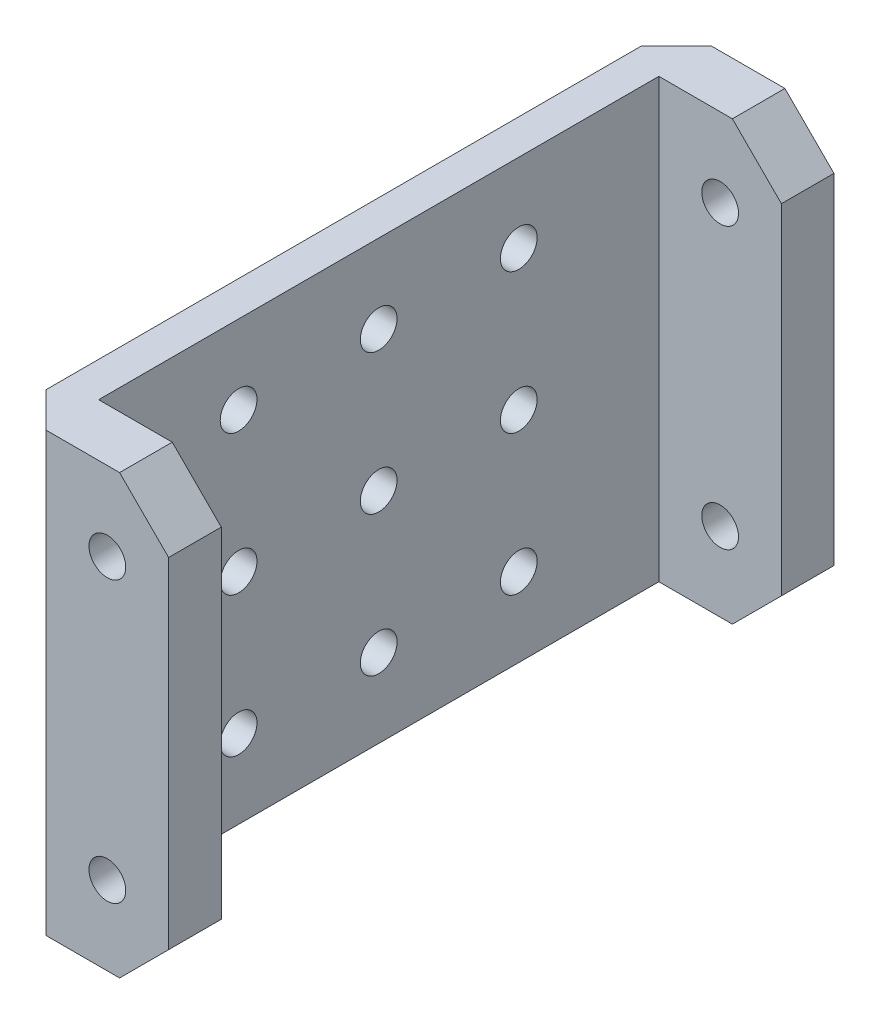
ISO-10303-21;
HEADER;
FILE_DESCRIPTION(('STEP AP214'),'2;1');
FILE_NAME('part.step','',(''),(''),'','','');
FILE_SCHEMA(('AUTOMOTIVE_DESIGN { 1 0 10303 214 1 1 1 1 }'));
ENDSEC;
DATA;
#1=APPLICATION_CONTEXT('core data for automotive mechanical design processes');
#2=APPLICATION_PROTOCOL_DEFINITION('international standard','automotive_design',2000,#1);
#3=PRODUCT_CONTEXT('',#1,'mechanical');
#4=PRODUCT('Part','Part','',(#3));
#5=PRODUCT_RELATED_PRODUCT_CATEGORY('part','',(#4));
#6=PRODUCT_DEFINITION_FORMATION('','',#4);
#7=PRODUCT_DEFINITION_CONTEXT('part definition',#1,'design');
#8=PRODUCT_DEFINITION('design','',#6,#7);
#9=PRODUCT_DEFINITION_SHAPE('','',#8);
#10=(LENGTH_UNIT() NAMED_UNIT(*) SI_UNIT(.MILLI.,.METRE.));
#11=(NAMED_UNIT(*) PLANE_ANGLE_UNIT() SI_UNIT($,.RADIAN.));
#12=(NAMED_UNIT(*) SI_UNIT($,.STERADIAN.) SOLID_ANGLE_UNIT());
#13=UNCERTAINTY_MEASURE_WITH_UNIT(LENGTH_MEASURE(1.E-05),#10,'distance_accuracy_value','');
#14=(GEOMETRIC_REPRESENTATION_CONTEXT(3) GLOBAL_UNCERTAINTY_ASSIGNED_CONTEXT((#13)) GLOBAL_UNIT_ASSIGNED_CONTEXT((#10,
#11,#12)) REPRESENTATION_CONTEXT('',''));
#15=CARTESIAN_POINT('',(0.,0.,0.));
#16=DIRECTION('',(0.,0.,1.));
#17=DIRECTION('',(1.,0.,0.));
#18=AXIS2_PLACEMENT_3D('',#15,#16,#17);
#19=CARTESIAN_POINT('',(9.,0.,0.));
#20=DIRECTION('',(-1.,0.,0.));
#21=DIRECTION('',(0.,0.,1.));
#22=AXIS2_PLACEMENT_3D('',#19,#20,#21);
#23=PLANE('',#22);
#24=DIRECTION('',(0.,1.,0.));
#25=VECTOR('',#24,1.);
#26=CARTESIAN_POINT('',(9.,0.,34.9928066134453));
#27=LINE('',#26,#25);
#28=CARTESIAN_POINT('',(9.,2.8,34.9928066134453));
#29=VERTEX_POINT('',#28);
#30=CARTESIAN_POINT('',(9.,22.2,34.9928066134453));
#31=VERTEX_POINT('',#30);
#32=EDGE_CURVE('E229',#29,#31,#27,.T.);
#33=ORIENTED_EDGE('',*,*,#32,.T.);
#34=DIRECTION('',(0.,0.,1.));
#35=VECTOR('',#34,1.);
#36=CARTESIAN_POINT('',(9.,22.2,0.));
#37=LINE('',#36,#35);
#38=CARTESIAN_POINT('',(9.,22.2,38.));
#39=VERTEX_POINT('',#38);
#40=EDGE_CURVE('E62',#31,#39,#37,.T.);
#41=ORIENTED_EDGE('',*,*,#40,.T.);
#42=DIRECTION('',(0.,1.,0.));
#43=VECTOR('',#42,1.);
#44=CARTESIAN_POINT('',(9.,0.,38.));
#45=LINE('',#44,#43);
#46=CARTESIAN_POINT('',(9.,2.8,38.));
#47=VERTEX_POINT('',#46);
#48=EDGE_CURVE('E241',#47,#39,#45,.T.);
#49=ORIENTED_EDGE('',*,*,#48,.F.);
#50=DIRECTION('',(0.,0.,1.));
#51=VECTOR('',#50,1.);
#52=CARTESIAN_POINT('',(9.,2.8,0.));
#53=LINE('',#52,#51);
#54=EDGE_CURVE('E278',#29,#47,#53,.T.);
#55=ORIENTED_EDGE('',*,*,#54,.F.);
#56=EDGE_LOOP('',(#33,#41,#49,#55));
#57=FACE_BOUND('',#56,.T.);
#58=ADVANCED_FACE('F38',(#57),#23,.F.);
#59=CARTESIAN_POINT('',(9.,0.,38.));
#60=DIRECTION('',(0.,0.,1.));
#61=DIRECTION('',(1.,0.,0.));
#62=AXIS2_PLACEMENT_3D('',#59,#60,#61);
#63=PLANE('',#62);
#64=DIRECTION('',(0.707106781186548,-0.707106781186548,0.));
#65=VECTOR('',#64,1.);
#66=CARTESIAN_POINT('',(20.1,11.1,38.));
#67=LINE('',#66,#65);
#68=CARTESIAN_POINT('',(6.2,25.,38.));
#69=VERTEX_POINT('',#68);
#70=EDGE_CURVE('E296',#69,#39,#67,.T.);
#71=ORIENTED_EDGE('',*,*,#70,.F.);
#72=DIRECTION('',(-1.,0.,0.));
#73=VECTOR('',#72,1.);
#74=CARTESIAN_POINT('',(9.,25.,38.));
#75=LINE('',#74,#73);
#76=CARTESIAN_POINT('',(1.99999999999999,25.,38.));
#77=VERTEX_POINT('',#76);
#78=EDGE_CURVE('E169',#69,#77,#75,.T.);
#79=ORIENTED_EDGE('',*,*,#78,.T.);
#80=DIRECTION('',(0.,-1.,0.));
#81=VECTOR('',#80,1.);
#82=CARTESIAN_POINT('',(1.99999999999999,0.,38.));
#83=LINE('',#82,#81);
#84=CARTESIAN_POINT('',(1.99999999999999,0.,38.));
#85=VERTEX_POINT('',#84);
#86=EDGE_CURVE('E203',#77,#85,#83,.T.);
#87=ORIENTED_EDGE('',*,*,#86,.T.);
#88=DIRECTION('',(-1.,0.,0.));
#89=VECTOR('',#88,1.);
#90=CARTESIAN_POINT('',(9.,0.,38.));
#91=LINE('',#90,#89);
#92=CARTESIAN_POINT('',(6.2,0.,38.));
#93=VERTEX_POINT('',#92);
#94=EDGE_CURVE('E173',#93,#85,#91,.T.);
#95=ORIENTED_EDGE('',*,*,#94,.F.);
#96=DIRECTION('',(-0.707106781186548,-0.707106781186548,0.));
#97=VECTOR('',#96,1.);
#98=CARTESIAN_POINT('',(7.6,1.4,38.));
#99=LINE('',#98,#97);
#100=EDGE_CURVE('E290',#47,#93,#99,.T.);
#101=ORIENTED_EDGE('',*,*,#100,.F.);
#102=ORIENTED_EDGE('',*,*,#48,.T.);
#103=EDGE_LOOP('',(#71,#79,#87,#95,#101,#102));
#104=FACE_BOUND('',#103,.T.);
#105=CARTESIAN_POINT('',(5.5,4.5,38.));
#106=DIRECTION('',(0.,0.,-1.));
#107=DIRECTION('',(-1.,0.,0.));
#108=AXIS2_PLACEMENT_3D('',#105,#106,#107);
#109=CIRCLE('',#108,1.04999999999999);
#110=CARTESIAN_POINT('',(4.45000000000001,4.5,38.));
#111=VERTEX_POINT('',#110);
#112=EDGE_CURVE('E363',#111,#111,#109,.T.);
#113=ORIENTED_EDGE('',*,*,#112,.T.);
#114=EDGE_LOOP('',(#113));
#115=FACE_BOUND('',#114,.T.);
#116=CARTESIAN_POINT('',(5.5,20.5,38.));
#117=DIRECTION('',(0.,0.,-1.));
#118=DIRECTION('',(-1.,0.,0.));
#119=AXIS2_PLACEMENT_3D('',#116,#117,#118);
#120=CIRCLE('',#119,1.04999999999999);
#121=CARTESIAN_POINT('',(4.45000000000001,20.5,38.));
#122=VERTEX_POINT('',#121);
#123=EDGE_CURVE('E371',#122,#122,#120,.T.);
#124=ORIENTED_EDGE('',*,*,#123,.T.);
#125=EDGE_LOOP('',(#124));
#126=FACE_BOUND('',#125,.T.);
#127=ADVANCED_FACE('F263',(#104,#115,#126),#63,.T.);
#128=CARTESIAN_POINT('',(9.,0.,0.));
#129=DIRECTION('',(0.,-1.,0.));
#130=DIRECTION('',(0.,0.,-1.));
#131=AXIS2_PLACEMENT_3D('',#128,#129,#130);
#132=PLANE('',#131);
#133=DIRECTION('',(0.,0.,1.));
#134=VECTOR('',#133,1.);
#135=CARTESIAN_POINT('',(6.2,0.,0.));
#136=LINE('',#135,#134);
#137=CARTESIAN_POINT('',(6.2,0.,34.9928066134453));
#138=VERTEX_POINT('',#137);
#139=EDGE_CURVE('E54',#138,#93,#136,.T.);
#140=ORIENTED_EDGE('',*,*,#139,.T.);
#141=ORIENTED_EDGE('',*,*,#94,.T.);
#142=DIRECTION('',(0.70710678118655,0.,0.707106781186545));
#143=VECTOR('',#142,1.);
#144=CARTESIAN_POINT('',(-13.5,0.,22.5000000000001));
#145=LINE('',#144,#143);
#146=CARTESIAN_POINT('',(0.,0.,36.));
#147=VERTEX_POINT('',#146);
#148=EDGE_CURVE('E187',#85,#147,#145,.F.);
#149=ORIENTED_EDGE('',*,*,#148,.T.);
#150=DIRECTION('',(0.,0.,1.));
#151=VECTOR('',#150,1.);
#152=CARTESIAN_POINT('',(0.,0.,0.));
#153=LINE('',#152,#151);
#154=CARTESIAN_POINT('',(0.,0.,1.99999999999999));
#155=VERTEX_POINT('',#154);
#156=EDGE_CURVE('E245',#155,#147,#153,.T.);
#157=ORIENTED_EDGE('',*,*,#156,.F.);
#158=DIRECTION('',(-0.707106781186551,0.,0.707106781186544));
#159=VECTOR('',#158,1.);
#160=CARTESIAN_POINT('',(5.50000000000004,0.,-3.5));
#161=LINE('',#160,#159);
#162=CARTESIAN_POINT('',(2.00000000000001,0.,0.));
#163=VERTEX_POINT('',#162);
#164=EDGE_CURVE('E190',#155,#163,#161,.F.);
#165=ORIENTED_EDGE('',*,*,#164,.T.);
#166=DIRECTION('',(-1.,0.,0.));
#167=VECTOR('',#166,1.);
#168=CARTESIAN_POINT('',(9.,0.,0.));
#169=LINE('',#168,#167);
#170=CARTESIAN_POINT('',(6.2,0.,0.));
#171=VERTEX_POINT('',#170);
#172=EDGE_CURVE('E168',#171,#163,#169,.T.);
#173=ORIENTED_EDGE('',*,*,#172,.F.);
#174=CARTESIAN_POINT('',(6.2,0.,3.));
#175=VERTEX_POINT('',#174);
#176=EDGE_CURVE('E151',#171,#175,#136,.T.);
#177=ORIENTED_EDGE('',*,*,#176,.T.);
#178=DIRECTION('',(-1.,0.,0.));
#179=VECTOR('',#178,1.);
#180=CARTESIAN_POINT('',(9.,0.,3.));
#181=LINE('',#180,#179);
#182=CARTESIAN_POINT('',(2.,0.,3.));
#183=VERTEX_POINT('',#182);
#184=EDGE_CURVE('E221',#175,#183,#181,.T.);
#185=ORIENTED_EDGE('',*,*,#184,.T.);
#186=DIRECTION('',(0.00010870675357016,0.,-0.999999994091421));
#187=VECTOR('',#186,1.);
#188=CARTESIAN_POINT('',(2.,0.,3.));
#189=LINE('',#188,#187);
#190=CARTESIAN_POINT('',(1.99652216583491,0.,34.9928066134453));
#191=VERTEX_POINT('',#190);
#192=EDGE_CURVE('E299',#191,#183,#189,.T.);
#193=ORIENTED_EDGE('',*,*,#192,.F.);
#194=DIRECTION('',(1.,0.,0.));
#195=VECTOR('',#194,1.);
#196=CARTESIAN_POINT('',(3.99652216583491,0.,34.9928066134453));
#197=LINE('',#196,#195);
#198=EDGE_CURVE('E230',#191,#138,#197,.T.);
#199=ORIENTED_EDGE('',*,*,#198,.T.);
#200=EDGE_LOOP('',(#140,#141,#149,#157,#165,#173,#177,#185,#193,#199));
#201=FACE_BOUND('',#200,.T.);
#202=ADVANCED_FACE('F256',(#201),#132,.T.);
#203=CARTESIAN_POINT('',(9.,25.,0.));
#204=DIRECTION('',(0.,0.,-1.));
#205=DIRECTION('',(0.,1.,0.));
#206=AXIS2_PLACEMENT_3D('',#203,#204,#205);
#207=PLANE('',#206);
#208=DIRECTION('',(0.707106781186547,-0.707106781186547,0.));
#209=VECTOR('',#208,1.);
#210=CARTESIAN_POINT('',(9.,22.2,0.));
#211=LINE('',#210,#209);
#212=CARTESIAN_POINT('',(6.2,25.,0.));
#213=VERTEX_POINT('',#212);
#214=CARTESIAN_POINT('',(9.,22.2,0.));
#215=VERTEX_POINT('',#214);
#216=EDGE_CURVE('E139',#213,#215,#211,.T.);
#217=ORIENTED_EDGE('',*,*,#216,.T.);
#218=DIRECTION('',(0.,-1.,0.));
#219=VECTOR('',#218,1.);
#220=CARTESIAN_POINT('',(9.,25.,0.));
#221=LINE('',#220,#219);
#222=CARTESIAN_POINT('',(9.,2.8,0.));
#223=VERTEX_POINT('',#222);
#224=EDGE_CURVE('E175',#215,#223,#221,.T.);
#225=ORIENTED_EDGE('',*,*,#224,.T.);
#226=DIRECTION('',(-0.707106781186547,-0.707106781186547,0.));
#227=VECTOR('',#226,1.);
#228=CARTESIAN_POINT('',(9.,2.8,0.));
#229=LINE('',#228,#227);
#230=EDGE_CURVE('E276',#223,#171,#229,.T.);
#231=ORIENTED_EDGE('',*,*,#230,.T.);
#232=ORIENTED_EDGE('',*,*,#172,.T.);
#233=DIRECTION('',(0.,1.,0.));
#234=VECTOR('',#233,1.);
#235=CARTESIAN_POINT('',(2.00000000000001,25.,0.));
#236=LINE('',#235,#234);
#237=CARTESIAN_POINT('',(2.00000000000001,25.,0.));
#238=VERTEX_POINT('',#237);
#239=EDGE_CURVE('E165',#163,#238,#236,.T.);
#240=ORIENTED_EDGE('',*,*,#239,.T.);
#241=DIRECTION('',(-1.,0.,0.));
#242=VECTOR('',#241,1.);
#243=CARTESIAN_POINT('',(9.,25.,0.));
#244=LINE('',#243,#242);
#245=EDGE_CURVE('E156',#213,#238,#244,.T.);
#246=ORIENTED_EDGE('',*,*,#245,.F.);
#247=EDGE_LOOP('',(#217,#225,#231,#232,#240,#246));
#248=FACE_BOUND('',#247,.T.);
#249=CARTESIAN_POINT('',(5.5,20.5,0.));
#250=DIRECTION('',(0.,0.,-1.));
#251=DIRECTION('',(0.,1.,0.));
#252=AXIS2_PLACEMENT_3D('',#249,#250,#251);
#253=CIRCLE('',#252,1.05);
#254=CARTESIAN_POINT('',(5.5,21.55,0.));
#255=VERTEX_POINT('',#254);
#256=EDGE_CURVE('E347',#255,#255,#253,.T.);
#257=ORIENTED_EDGE('',*,*,#256,.F.);
#258=EDGE_LOOP('',(#257));
#259=FACE_BOUND('',#258,.T.);
#260=CARTESIAN_POINT('',(5.5,4.5,0.));
#261=DIRECTION('',(0.,0.,-1.));
#262=DIRECTION('',(0.,1.,0.));
#263=AXIS2_PLACEMENT_3D('',#260,#261,#262);
#264=CIRCLE('',#263,1.05);
#265=CARTESIAN_POINT('',(5.5,5.55,0.));
#266=VERTEX_POINT('',#265);
#267=EDGE_CURVE('E355',#266,#266,#264,.T.);
#268=ORIENTED_EDGE('',*,*,#267,.F.);
#269=EDGE_LOOP('',(#268));
#270=FACE_BOUND('',#269,.T.);
#271=ADVANCED_FACE('F162',(#248,#259,#270),#207,.T.);
#272=CARTESIAN_POINT('',(9.,25.,38.));
#273=DIRECTION('',(0.,1.,0.));
#274=DIRECTION('',(0.,0.,1.));
#275=AXIS2_PLACEMENT_3D('',#272,#273,#274);
#276=PLANE('',#275);
#277=DIRECTION('',(0.,0.,1.));
#278=VECTOR('',#277,1.);
#279=CARTESIAN_POINT('',(6.2,25.,0.));
#280=LINE('',#279,#278);
#281=CARTESIAN_POINT('',(6.2,25.,3.));
#282=VERTEX_POINT('',#281);
#283=EDGE_CURVE('E142',#213,#282,#280,.T.);
#284=ORIENTED_EDGE('',*,*,#283,.F.);
#285=ORIENTED_EDGE('',*,*,#245,.T.);
#286=DIRECTION('',(0.707106781186551,0.,-0.707106781186544));
#287=VECTOR('',#286,1.);
#288=CARTESIAN_POINT('',(-13.5,25.,15.4999999999998));
#289=LINE('',#288,#287);
#290=CARTESIAN_POINT('',(0.,25.,1.99999999999999));
#291=VERTEX_POINT('',#290);
#292=EDGE_CURVE('E200',#238,#291,#289,.F.);
#293=ORIENTED_EDGE('',*,*,#292,.T.);
#294=DIRECTION('',(0.,0.,-1.));
#295=VECTOR('',#294,1.);
#296=CARTESIAN_POINT('',(0.,25.,38.));
#297=LINE('',#296,#295);
#298=CARTESIAN_POINT('',(0.,25.,36.));
#299=VERTEX_POINT('',#298);
#300=EDGE_CURVE('E235',#299,#291,#297,.T.);
#301=ORIENTED_EDGE('',*,*,#300,.F.);
#302=DIRECTION('',(-0.70710678118655,0.,-0.707106781186545));
#303=VECTOR('',#302,1.);
#304=CARTESIAN_POINT('',(5.50000000000002,25.,41.5));
#305=LINE('',#304,#303);
#306=EDGE_CURVE('E196',#299,#77,#305,.F.);
#307=ORIENTED_EDGE('',*,*,#306,.T.);
#308=ORIENTED_EDGE('',*,*,#78,.F.);
#309=CARTESIAN_POINT('',(6.2,25.,34.9928066134453));
#310=VERTEX_POINT('',#309);
#311=EDGE_CURVE('E150',#310,#69,#280,.T.);
#312=ORIENTED_EDGE('',*,*,#311,.F.);
#313=DIRECTION('',(1.,0.,0.));
#314=VECTOR('',#313,1.);
#315=CARTESIAN_POINT('',(3.99652216583491,25.,34.9928066134453));
#316=LINE('',#315,#314);
#317=CARTESIAN_POINT('',(1.99652216583491,25.,34.9928066134453));
#318=VERTEX_POINT('',#317);
#319=EDGE_CURVE('E412',#318,#310,#316,.T.);
#320=ORIENTED_EDGE('',*,*,#319,.F.);
#321=DIRECTION('',(0.00010870675357016,0.,-0.999999994091421));
#322=VECTOR('',#321,1.);
#323=CARTESIAN_POINT('',(2.,25.,3.));
#324=LINE('',#323,#322);
#325=CARTESIAN_POINT('',(2.,25.,3.));
#326=VERTEX_POINT('',#325);
#327=EDGE_CURVE('E300',#318,#326,#324,.T.);
#328=ORIENTED_EDGE('',*,*,#327,.T.);
#329=DIRECTION('',(-1.,0.,0.));
#330=VECTOR('',#329,1.);
#331=CARTESIAN_POINT('',(9.,25.,3.));
#332=LINE('',#331,#330);
#333=EDGE_CURVE('E159',#282,#326,#332,.T.);
#334=ORIENTED_EDGE('',*,*,#333,.F.);
#335=EDGE_LOOP('',(#284,#285,#293,#301,#307,#308,#312,#320,#328,#334));
#336=FACE_BOUND('',#335,.T.);
#337=ADVANCED_FACE('F155',(#336),#276,.T.);
#338=ORIENTED_EDGE('',*,*,#224,.F.);
#339=CARTESIAN_POINT('',(9.,22.2,3.));
#340=VERTEX_POINT('',#339);
#341=EDGE_CURVE('E144',#215,#340,#37,.T.);
#342=ORIENTED_EDGE('',*,*,#341,.T.);
#343=DIRECTION('',(0.,1.,0.));
#344=VECTOR('',#343,1.);
#345=CARTESIAN_POINT('',(9.,0.,3.));
#346=LINE('',#345,#344);
#347=CARTESIAN_POINT('',(9.,2.8,3.));
#348=VERTEX_POINT('',#347);
#349=EDGE_CURVE('E219',#348,#340,#346,.T.);
#350=ORIENTED_EDGE('',*,*,#349,.F.);
#351=EDGE_CURVE('E227',#223,#348,#53,.T.);
#352=ORIENTED_EDGE('',*,*,#351,.F.);
#353=EDGE_LOOP('',(#338,#342,#350,#352));
#354=FACE_BOUND('',#353,.T.);
#355=ADVANCED_FACE('F226',(#354),#23,.F.);
#356=CARTESIAN_POINT('',(0.,0.,0.));
#357=DIRECTION('',(-1.,0.,0.));
#358=DIRECTION('',(0.,0.,1.));
#359=AXIS2_PLACEMENT_3D('',#356,#357,#358);
#360=PLANE('',#359);
#361=CARTESIAN_POINT('',(0.,4.5,27.));
#362=DIRECTION('',(-1.,0.,0.));
#363=DIRECTION('',(0.,0.,1.));
#364=AXIS2_PLACEMENT_3D('',#361,#362,#363);
#365=CIRCLE('',#364,1.04999999999999);
#366=CARTESIAN_POINT('',(0.,4.5,28.05));
#367=VERTEX_POINT('',#366);
#368=EDGE_CURVE('E375',#367,#367,#365,.T.);
#369=ORIENTED_EDGE('',*,*,#368,.F.);
#370=EDGE_LOOP('',(#369));
#371=FACE_BOUND('',#370,.T.);
#372=CARTESIAN_POINT('',(0.,12.5,27.));
#373=DIRECTION('',(-1.,0.,0.));
#374=DIRECTION('',(0.,0.,1.));
#375=AXIS2_PLACEMENT_3D('',#372,#373,#374);
#376=CIRCLE('',#375,1.04999999999999);
#377=CARTESIAN_POINT('',(0.,12.5,28.05));
#378=VERTEX_POINT('',#377);
#379=EDGE_CURVE('E379',#378,#378,#376,.T.);
#380=ORIENTED_EDGE('',*,*,#379,.F.);
#381=EDGE_LOOP('',(#380));
#382=FACE_BOUND('',#381,.T.);
#383=CARTESIAN_POINT('',(0.,20.5,27.));
#384=DIRECTION('',(-1.,0.,0.));
#385=DIRECTION('',(0.,0.,1.));
#386=AXIS2_PLACEMENT_3D('',#383,#384,#385);
#387=CIRCLE('',#386,1.04999999999998);
#388=CARTESIAN_POINT('',(0.,20.5,28.05));
#389=VERTEX_POINT('',#388);
#390=EDGE_CURVE('E383',#389,#389,#387,.T.);
#391=ORIENTED_EDGE('',*,*,#390,.F.);
#392=EDGE_LOOP('',(#391));
#393=FACE_BOUND('',#392,.T.);
#394=CARTESIAN_POINT('',(0.,12.5,11.));
#395=DIRECTION('',(-1.,0.,0.));
#396=DIRECTION('',(0.,0.,1.));
#397=AXIS2_PLACEMENT_3D('',#394,#395,#396);
#398=CIRCLE('',#397,1.04999999999999);
#399=CARTESIAN_POINT('',(0.,12.5,12.05));
#400=VERTEX_POINT('',#399);
#401=EDGE_CURVE('E387',#400,#400,#398,.T.);
#402=ORIENTED_EDGE('',*,*,#401,.F.);
#403=EDGE_LOOP('',(#402));
#404=FACE_BOUND('',#403,.T.);
#405=CARTESIAN_POINT('',(0.,20.5,11.));
#406=DIRECTION('',(-1.,0.,0.));
#407=DIRECTION('',(0.,0.,1.));
#408=AXIS2_PLACEMENT_3D('',#405,#406,#407);
#409=CIRCLE('',#408,1.04999999999998);
#410=CARTESIAN_POINT('',(0.,20.5,12.05));
#411=VERTEX_POINT('',#410);
#412=EDGE_CURVE('E391',#411,#411,#409,.T.);
#413=ORIENTED_EDGE('',*,*,#412,.F.);
#414=EDGE_LOOP('',(#413));
#415=FACE_BOUND('',#414,.T.);
#416=CARTESIAN_POINT('',(0.,20.5,19.));
#417=DIRECTION('',(-1.,0.,0.));
#418=DIRECTION('',(0.,0.,1.));
#419=AXIS2_PLACEMENT_3D('',#416,#417,#418);
#420=CIRCLE('',#419,1.04999999999998);
#421=CARTESIAN_POINT('',(0.,20.5,20.05));
#422=VERTEX_POINT('',#421);
#423=EDGE_CURVE('E395',#422,#422,#420,.T.);
#424=ORIENTED_EDGE('',*,*,#423,.F.);
#425=EDGE_LOOP('',(#424));
#426=FACE_BOUND('',#425,.T.);
#427=CARTESIAN_POINT('',(0.,12.5,19.));
#428=DIRECTION('',(-1.,0.,0.));
#429=DIRECTION('',(0.,0.,1.));
#430=AXIS2_PLACEMENT_3D('',#427,#428,#429);
#431=CIRCLE('',#430,1.04999999999999);
#432=CARTESIAN_POINT('',(0.,12.5,20.05));
#433=VERTEX_POINT('',#432);
#434=EDGE_CURVE('E399',#433,#433,#431,.T.);
#435=ORIENTED_EDGE('',*,*,#434,.F.);
#436=EDGE_LOOP('',(#435));
#437=FACE_BOUND('',#436,.T.);
#438=CARTESIAN_POINT('',(0.,4.5,19.));
#439=DIRECTION('',(-1.,0.,0.));
#440=DIRECTION('',(0.,0.,1.));
#441=AXIS2_PLACEMENT_3D('',#438,#439,#440);
#442=CIRCLE('',#441,1.04999999999999);
#443=CARTESIAN_POINT('',(0.,4.5,20.05));
#444=VERTEX_POINT('',#443);
#445=EDGE_CURVE('E403',#444,#444,#442,.T.);
#446=ORIENTED_EDGE('',*,*,#445,.F.);
#447=EDGE_LOOP('',(#446));
#448=FACE_BOUND('',#447,.T.);
#449=CARTESIAN_POINT('',(0.,4.5,11.));
#450=DIRECTION('',(-1.,0.,0.));
#451=DIRECTION('',(0.,0.,1.));
#452=AXIS2_PLACEMENT_3D('',#449,#450,#451);
#453=CIRCLE('',#452,1.04999999999999);
#454=CARTESIAN_POINT('',(0.,4.5,12.05));
#455=VERTEX_POINT('',#454);
#456=EDGE_CURVE('E407',#455,#455,#453,.T.);
#457=ORIENTED_EDGE('',*,*,#456,.F.);
#458=EDGE_LOOP('',(#457));
#459=FACE_BOUND('',#458,.T.);
#460=ORIENTED_EDGE('',*,*,#300,.T.);
#461=DIRECTION('',(0.,-1.,0.));
#462=VECTOR('',#461,1.);
#463=CARTESIAN_POINT('',(0.,0.,1.99999999999999));
#464=LINE('',#463,#462);
#465=EDGE_CURVE('E183',#291,#155,#464,.T.);
#466=ORIENTED_EDGE('',*,*,#465,.T.);
#467=ORIENTED_EDGE('',*,*,#156,.T.);
#468=DIRECTION('',(0.,1.,0.));
#469=VECTOR('',#468,1.);
#470=CARTESIAN_POINT('',(0.,0.,36.));
#471=LINE('',#470,#469);
#472=EDGE_CURVE('E179',#147,#299,#471,.T.);
#473=ORIENTED_EDGE('',*,*,#472,.T.);
#474=EDGE_LOOP('',(#460,#466,#467,#473));
#475=FACE_BOUND('',#474,.T.);
#476=ADVANCED_FACE('F270',(#371,#382,#393,#404,#415,#426,#437,#448,#459,#475),#360,.T.);
#477=CARTESIAN_POINT('',(3.99652216583491,0.,34.9928066134453));
#478=DIRECTION('',(0.,0.,1.));
#479=DIRECTION('',(1.,0.,0.));
#480=AXIS2_PLACEMENT_3D('',#477,#478,#479);
#481=PLANE('',#480);
#482=CARTESIAN_POINT('',(5.5,4.5,34.9928066134453));
#483=DIRECTION('',(0.,0.,-1.));
#484=DIRECTION('',(-1.,0.,0.));
#485=AXIS2_PLACEMENT_3D('',#482,#483,#484);
#486=CIRCLE('',#485,1.04999999999999);
#487=CARTESIAN_POINT('',(4.45000000000001,4.5,34.9928066134453));
#488=VERTEX_POINT('',#487);
#489=EDGE_CURVE('E359',#488,#488,#486,.T.);
#490=ORIENTED_EDGE('',*,*,#489,.F.);
#491=EDGE_LOOP('',(#490));
#492=FACE_BOUND('',#491,.T.);
#493=CARTESIAN_POINT('',(5.5,20.5,34.9928066134453));
#494=DIRECTION('',(0.,0.,-1.));
#495=DIRECTION('',(-1.,0.,0.));
#496=AXIS2_PLACEMENT_3D('',#493,#494,#495);
#497=CIRCLE('',#496,1.04999999999999);
#498=CARTESIAN_POINT('',(4.45000000000001,20.5,34.9928066134453));
#499=VERTEX_POINT('',#498);
#500=EDGE_CURVE('E367',#499,#499,#497,.T.);
#501=ORIENTED_EDGE('',*,*,#500,.F.);
#502=EDGE_LOOP('',(#501));
#503=FACE_BOUND('',#502,.T.);
#504=ORIENTED_EDGE('',*,*,#319,.T.);
#505=DIRECTION('',(0.707106781186548,-0.707106781186548,0.));
#506=VECTOR('',#505,1.);
#507=CARTESIAN_POINT('',(17.5982610829175,13.6017389170825,34.9928066134453));
#508=LINE('',#507,#506);
#509=EDGE_CURVE('E293',#310,#31,#508,.T.);
#510=ORIENTED_EDGE('',*,*,#509,.T.);
#511=ORIENTED_EDGE('',*,*,#32,.F.);
#512=DIRECTION('',(-0.707106781186548,-0.707106781186548,0.));
#513=VECTOR('',#512,1.);
#514=CARTESIAN_POINT('',(5.09826108291745,-1.10173891708255,34.9928066134453));
#515=LINE('',#514,#513);
#516=EDGE_CURVE('E287',#29,#138,#515,.T.);
#517=ORIENTED_EDGE('',*,*,#516,.T.);
#518=ORIENTED_EDGE('',*,*,#198,.F.);
#519=DIRECTION('',(0.,-1.,0.));
#520=VECTOR('',#519,1.);
#521=CARTESIAN_POINT('',(1.99652216583491,25.,34.9928066134453));
#522=LINE('',#521,#520);
#523=EDGE_CURVE('E303',#318,#191,#522,.T.);
#524=ORIENTED_EDGE('',*,*,#523,.F.);
#525=EDGE_LOOP('',(#504,#510,#511,#517,#518,#524));
#526=FACE_BOUND('',#525,.T.);
#527=ADVANCED_FACE('F419',(#492,#503,#526),#481,.F.);
#528=CARTESIAN_POINT('',(9.,0.,3.));
#529=DIRECTION('',(0.,0.,-1.));
#530=DIRECTION('',(-1.,0.,0.));
#531=AXIS2_PLACEMENT_3D('',#528,#529,#530);
#532=PLANE('',#531);
#533=CARTESIAN_POINT('',(5.5,20.5,3.));
#534=DIRECTION('',(0.,0.,1.));
#535=DIRECTION('',(1.,0.,0.));
#536=AXIS2_PLACEMENT_3D('',#533,#534,#535);
#537=CIRCLE('',#536,1.05);
#538=CARTESIAN_POINT('',(6.55,20.5,3.));
#539=VERTEX_POINT('',#538);
#540=EDGE_CURVE('E343',#539,#539,#537,.T.);
#541=ORIENTED_EDGE('',*,*,#540,.F.);
#542=EDGE_LOOP('',(#541));
#543=FACE_BOUND('',#542,.T.);
#544=CARTESIAN_POINT('',(5.5,4.5,3.));
#545=DIRECTION('',(0.,0.,1.));
#546=DIRECTION('',(1.,0.,0.));
#547=AXIS2_PLACEMENT_3D('',#544,#545,#546);
#548=CIRCLE('',#547,1.05);
#549=CARTESIAN_POINT('',(6.55,4.5,3.));
#550=VERTEX_POINT('',#549);
#551=EDGE_CURVE('E351',#550,#550,#548,.T.);
#552=ORIENTED_EDGE('',*,*,#551,.F.);
#553=EDGE_LOOP('',(#552));
#554=FACE_BOUND('',#553,.T.);
#555=ORIENTED_EDGE('',*,*,#349,.T.);
#556=DIRECTION('',(-0.707106781186548,0.707106781186548,0.));
#557=VECTOR('',#556,1.);
#558=CARTESIAN_POINT('',(20.1,11.1,3.));
#559=LINE('',#558,#557);
#560=EDGE_CURVE('E11',#340,#282,#559,.T.);
#561=ORIENTED_EDGE('',*,*,#560,.T.);
#562=ORIENTED_EDGE('',*,*,#333,.T.);
#563=DIRECTION('',(0.,-1.,0.));
#564=VECTOR('',#563,1.);
#565=CARTESIAN_POINT('',(2.,25.,3.));
#566=LINE('',#565,#564);
#567=EDGE_CURVE('E211',#326,#183,#566,.T.);
#568=ORIENTED_EDGE('',*,*,#567,.T.);
#569=ORIENTED_EDGE('',*,*,#184,.F.);
#570=DIRECTION('',(0.707106781186548,0.707106781186548,0.));
#571=VECTOR('',#570,1.);
#572=CARTESIAN_POINT('',(7.6,1.4,3.));
#573=LINE('',#572,#571);
#574=EDGE_CURVE('E47',#175,#348,#573,.T.);
#575=ORIENTED_EDGE('',*,*,#574,.T.);
#576=EDGE_LOOP('',(#555,#561,#562,#568,#569,#575));
#577=FACE_BOUND('',#576,.T.);
#578=ADVANCED_FACE('F218',(#543,#554,#577),#532,.F.);
#579=CARTESIAN_POINT('',(0.,4.5,11.));
#580=DIRECTION('',(-1.,0.,0.));
#581=DIRECTION('',(0.,0.,1.));
#582=AXIS2_PLACEMENT_3D('',#579,#580,#581);
#583=CYLINDRICAL_SURFACE('',#582,1.04999999999999);
#584=CARTESIAN_POINT('',(1.9991303459663,4.5,11.));
#585=DIRECTION('',(-0.999999994091421,0.,-0.00010870675357016));
#586=DIRECTION('',(-0.00010870675357016,0.,0.999999994091421));
#587=AXIS2_PLACEMENT_3D('',#584,#585,#586);
#588=ELLIPSE('',#587,1.05000000620399,1.04999999999999);
#589=CARTESIAN_POINT('',(1.99901620387438,4.5,12.05));
#590=VERTEX_POINT('',#589);
#591=EDGE_CURVE('E339',#590,#590,#588,.F.);
#592=ORIENTED_EDGE('',*,*,#591,.T.);
#593=EDGE_LOOP('',(#592));
#594=FACE_BOUND('',#593,.T.);
#595=ORIENTED_EDGE('',*,*,#456,.T.);
#596=EDGE_LOOP('',(#595));
#597=FACE_BOUND('',#596,.T.);
#598=ADVANCED_FACE('F451',(#594,#597),#583,.F.);
#599=CARTESIAN_POINT('',(0.,4.5,19.));
#600=DIRECTION('',(-1.,0.,0.));
#601=DIRECTION('',(0.,0.,1.));
#602=AXIS2_PLACEMENT_3D('',#599,#600,#601);
#603=CYLINDRICAL_SURFACE('',#602,1.04999999999999);
#604=CARTESIAN_POINT('',(1.9982606919326,4.5,19.));
#605=DIRECTION('',(-0.999999994091421,0.,-0.00010870675357016));
#606=DIRECTION('',(-0.00010870675357016,0.,0.999999994091421));
#607=AXIS2_PLACEMENT_3D('',#604,#605,#606);
#608=ELLIPSE('',#607,1.05000000620399,1.04999999999999);
#609=CARTESIAN_POINT('',(1.99814654984068,4.5,20.05));
#610=VERTEX_POINT('',#609);
#611=EDGE_CURVE('E335',#610,#610,#608,.F.);
#612=ORIENTED_EDGE('',*,*,#611,.T.);
#613=EDGE_LOOP('',(#612));
#614=FACE_BOUND('',#613,.T.);
#615=ORIENTED_EDGE('',*,*,#445,.T.);
#616=EDGE_LOOP('',(#615));
#617=FACE_BOUND('',#616,.T.);
#618=ADVANCED_FACE('F454',(#614,#617),#603,.F.);
#619=CARTESIAN_POINT('',(0.,12.5,19.));
#620=DIRECTION('',(-1.,0.,0.));
#621=DIRECTION('',(0.,0.,1.));
#622=AXIS2_PLACEMENT_3D('',#619,#620,#621);
#623=CYLINDRICAL_SURFACE('',#622,1.04999999999999);
#624=CARTESIAN_POINT('',(1.9982606919326,12.5,19.));
#625=DIRECTION('',(-0.999999994091421,0.,-0.00010870675357016));
#626=DIRECTION('',(-0.00010870675357016,0.,0.999999994091421));
#627=AXIS2_PLACEMENT_3D('',#624,#625,#626);
#628=ELLIPSE('',#627,1.05000000620399,1.04999999999999);
#629=CARTESIAN_POINT('',(1.99814654984068,12.5,20.05));
#630=VERTEX_POINT('',#629);
#631=EDGE_CURVE('E331',#630,#630,#628,.F.);
#632=ORIENTED_EDGE('',*,*,#631,.T.);
#633=EDGE_LOOP('',(#632));
#634=FACE_BOUND('',#633,.T.);
#635=ORIENTED_EDGE('',*,*,#434,.T.);
#636=EDGE_LOOP('',(#635));
#637=FACE_BOUND('',#636,.T.);
#638=ADVANCED_FACE('F485',(#634,#637),#623,.F.);
#639=CARTESIAN_POINT('',(0.,20.5,19.));
#640=DIRECTION('',(-1.,0.,0.));
#641=DIRECTION('',(0.,0.,1.));
#642=AXIS2_PLACEMENT_3D('',#639,#640,#641);
#643=CYLINDRICAL_SURFACE('',#642,1.04999999999998);
#644=CARTESIAN_POINT('',(1.9982606919326,20.5,19.));
#645=DIRECTION('',(-0.999999994091421,0.,-0.00010870675357016));
#646=DIRECTION('',(-0.00010870675357016,0.,0.999999994091421));
#647=AXIS2_PLACEMENT_3D('',#644,#645,#646);
#648=ELLIPSE('',#647,1.05000000620399,1.04999999999998);
#649=CARTESIAN_POINT('',(1.99814654984068,20.5,20.05));
#650=VERTEX_POINT('',#649);
#651=EDGE_CURVE('E327',#650,#650,#648,.F.);
#652=ORIENTED_EDGE('',*,*,#651,.T.);
#653=EDGE_LOOP('',(#652));
#654=FACE_BOUND('',#653,.T.);
#655=ORIENTED_EDGE('',*,*,#423,.T.);
#656=EDGE_LOOP('',(#655));
#657=FACE_BOUND('',#656,.T.);
#658=ADVANCED_FACE('F489',(#654,#657),#643,.F.);
#659=CARTESIAN_POINT('',(0.,20.5,11.));
#660=DIRECTION('',(-1.,0.,0.));
#661=DIRECTION('',(0.,0.,1.));
#662=AXIS2_PLACEMENT_3D('',#659,#660,#661);
#663=CYLINDRICAL_SURFACE('',#662,1.04999999999998);
#664=CARTESIAN_POINT('',(1.9991303459663,20.5,11.));
#665=DIRECTION('',(-0.999999994091421,0.,-0.00010870675357016));
#666=DIRECTION('',(-0.00010870675357016,0.,0.999999994091421));
#667=AXIS2_PLACEMENT_3D('',#664,#665,#666);
#668=ELLIPSE('',#667,1.05000000620399,1.04999999999998);
#669=CARTESIAN_POINT('',(1.99901620387438,20.5,12.05));
#670=VERTEX_POINT('',#669);
#671=EDGE_CURVE('E323',#670,#670,#668,.F.);
#672=ORIENTED_EDGE('',*,*,#671,.T.);
#673=EDGE_LOOP('',(#672));
#674=FACE_BOUND('',#673,.T.);
#675=ORIENTED_EDGE('',*,*,#412,.T.);
#676=EDGE_LOOP('',(#675));
#677=FACE_BOUND('',#676,.T.);
#678=ADVANCED_FACE('F493',(#674,#677),#663,.F.);
#679=CARTESIAN_POINT('',(0.,12.5,11.));
#680=DIRECTION('',(-1.,0.,0.));
#681=DIRECTION('',(0.,0.,1.));
#682=AXIS2_PLACEMENT_3D('',#679,#680,#681);
#683=CYLINDRICAL_SURFACE('',#682,1.04999999999999);
#684=CARTESIAN_POINT('',(1.9991303459663,12.5,11.));
#685=DIRECTION('',(-0.999999994091421,0.,-0.00010870675357016));
#686=DIRECTION('',(-0.00010870675357016,0.,0.999999994091421));
#687=AXIS2_PLACEMENT_3D('',#684,#685,#686);
#688=ELLIPSE('',#687,1.05000000620399,1.04999999999999);
#689=CARTESIAN_POINT('',(1.99901620387438,12.5,12.05));
#690=VERTEX_POINT('',#689);
#691=EDGE_CURVE('E319',#690,#690,#688,.F.);
#692=ORIENTED_EDGE('',*,*,#691,.T.);
#693=EDGE_LOOP('',(#692));
#694=FACE_BOUND('',#693,.T.);
#695=ORIENTED_EDGE('',*,*,#401,.T.);
#696=EDGE_LOOP('',(#695));
#697=FACE_BOUND('',#696,.T.);
#698=ADVANCED_FACE('F497',(#694,#697),#683,.F.);
#699=CARTESIAN_POINT('',(0.,20.5,27.));
#700=DIRECTION('',(-1.,0.,0.));
#701=DIRECTION('',(0.,0.,1.));
#702=AXIS2_PLACEMENT_3D('',#699,#700,#701);
#703=CYLINDRICAL_SURFACE('',#702,1.04999999999998);
#704=CARTESIAN_POINT('',(1.9973910378989,20.5,27.));
#705=DIRECTION('',(-0.999999994091421,0.,-0.00010870675357016));
#706=DIRECTION('',(-0.00010870675357016,0.,0.999999994091421));
#707=AXIS2_PLACEMENT_3D('',#704,#705,#706);
#708=ELLIPSE('',#707,1.05000000620399,1.04999999999998);
#709=CARTESIAN_POINT('',(1.99727689580698,20.5,28.05));
#710=VERTEX_POINT('',#709);
#711=EDGE_CURVE('E315',#710,#710,#708,.F.);
#712=ORIENTED_EDGE('',*,*,#711,.T.);
#713=EDGE_LOOP('',(#712));
#714=FACE_BOUND('',#713,.T.);
#715=ORIENTED_EDGE('',*,*,#390,.T.);
#716=EDGE_LOOP('',(#715));
#717=FACE_BOUND('',#716,.T.);
#718=ADVANCED_FACE('F501',(#714,#717),#703,.F.);
#719=CARTESIAN_POINT('',(0.,12.5,27.));
#720=DIRECTION('',(-1.,0.,0.));
#721=DIRECTION('',(0.,0.,1.));
#722=AXIS2_PLACEMENT_3D('',#719,#720,#721);
#723=CYLINDRICAL_SURFACE('',#722,1.04999999999999);
#724=CARTESIAN_POINT('',(1.9973910378989,12.5,27.));
#725=DIRECTION('',(-0.999999994091421,0.,-0.00010870675357016));
#726=DIRECTION('',(-0.00010870675357016,0.,0.999999994091421));
#727=AXIS2_PLACEMENT_3D('',#724,#725,#726);
#728=ELLIPSE('',#727,1.05000000620399,1.04999999999999);
#729=CARTESIAN_POINT('',(1.99727689580698,12.5,28.05));
#730=VERTEX_POINT('',#729);
#731=EDGE_CURVE('E210',#730,#730,#728,.F.);
#732=ORIENTED_EDGE('',*,*,#731,.T.);
#733=EDGE_LOOP('',(#732));
#734=FACE_BOUND('',#733,.T.);
#735=ORIENTED_EDGE('',*,*,#379,.T.);
#736=EDGE_LOOP('',(#735));
#737=FACE_BOUND('',#736,.T.);
#738=ADVANCED_FACE('F505',(#734,#737),#723,.F.);
#739=CARTESIAN_POINT('',(0.,4.5,27.));
#740=DIRECTION('',(-1.,0.,0.));
#741=DIRECTION('',(0.,0.,1.));
#742=AXIS2_PLACEMENT_3D('',#739,#740,#741);
#743=CYLINDRICAL_SURFACE('',#742,1.04999999999999);
#744=CARTESIAN_POINT('',(1.9973910378989,4.5,27.));
#745=DIRECTION('',(-0.999999994091421,0.,-0.00010870675357016));
#746=DIRECTION('',(-0.00010870675357016,0.,0.999999994091421));
#747=AXIS2_PLACEMENT_3D('',#744,#745,#746);
#748=ELLIPSE('',#747,1.05000000620399,1.04999999999999);
#749=CARTESIAN_POINT('',(1.99727689580698,4.5,28.05));
#750=VERTEX_POINT('',#749);
#751=EDGE_CURVE('E207',#750,#750,#748,.F.);
#752=ORIENTED_EDGE('',*,*,#751,.T.);
#753=EDGE_LOOP('',(#752));
#754=FACE_BOUND('',#753,.T.);
#755=ORIENTED_EDGE('',*,*,#368,.T.);
#756=EDGE_LOOP('',(#755));
#757=FACE_BOUND('',#756,.T.);
#758=ADVANCED_FACE('F509',(#754,#757),#743,.F.);
#759=CARTESIAN_POINT('',(5.5,20.5,34.9928066134453));
#760=DIRECTION('',(0.,0.,-1.));
#761=DIRECTION('',(-1.,0.,0.));
#762=AXIS2_PLACEMENT_3D('',#759,#760,#761);
#763=CYLINDRICAL_SURFACE('',#762,1.04999999999999);
#764=ORIENTED_EDGE('',*,*,#123,.F.);
#765=EDGE_LOOP('',(#764));
#766=FACE_BOUND('',#765,.T.);
#767=ORIENTED_EDGE('',*,*,#500,.T.);
#768=EDGE_LOOP('',(#767));
#769=FACE_BOUND('',#768,.T.);
#770=ADVANCED_FACE('F513',(#766,#769),#763,.F.);
#771=CARTESIAN_POINT('',(5.5,4.5,34.9928066134453));
#772=DIRECTION('',(0.,0.,-1.));
#773=DIRECTION('',(-1.,0.,0.));
#774=AXIS2_PLACEMENT_3D('',#771,#772,#773);
#775=CYLINDRICAL_SURFACE('',#774,1.04999999999999);
#776=ORIENTED_EDGE('',*,*,#112,.F.);
#777=EDGE_LOOP('',(#776));
#778=FACE_BOUND('',#777,.T.);
#779=ORIENTED_EDGE('',*,*,#489,.T.);
#780=EDGE_LOOP('',(#779));
#781=FACE_BOUND('',#780,.T.);
#782=ADVANCED_FACE('F517',(#778,#781),#775,.F.);
#783=CARTESIAN_POINT('',(0.,0.,1.99999999999999));
#784=DIRECTION('',(0.707106781186544,0.,0.707106781186551));
#785=DIRECTION('',(0.,-1.,0.));
#786=AXIS2_PLACEMENT_3D('',#783,#784,#785);
#787=PLANE('',#786);
#788=ORIENTED_EDGE('',*,*,#292,.F.);
#789=ORIENTED_EDGE('',*,*,#239,.F.);
#790=ORIENTED_EDGE('',*,*,#164,.F.);
#791=ORIENTED_EDGE('',*,*,#465,.F.);
#792=EDGE_LOOP('',(#788,#789,#790,#791));
#793=FACE_BOUND('',#792,.T.);
#794=ADVANCED_FACE('F273',(#793),#787,.F.);
#795=CARTESIAN_POINT('',(0.,0.,36.));
#796=DIRECTION('',(0.707106781186545,0.,-0.70710678118655));
#797=DIRECTION('',(0.,1.,0.));
#798=AXIS2_PLACEMENT_3D('',#795,#796,#797);
#799=PLANE('',#798);
#800=ORIENTED_EDGE('',*,*,#148,.F.);
#801=ORIENTED_EDGE('',*,*,#86,.F.);
#802=ORIENTED_EDGE('',*,*,#306,.F.);
#803=ORIENTED_EDGE('',*,*,#472,.F.);
#804=EDGE_LOOP('',(#800,#801,#802,#803));
#805=FACE_BOUND('',#804,.T.);
#806=ADVANCED_FACE('F40',(#805),#799,.F.);
#807=CARTESIAN_POINT('',(5.5,4.5,-7.));
#808=DIRECTION('',(0.,0.,1.));
#809=DIRECTION('',(1.,0.,0.));
#810=AXIS2_PLACEMENT_3D('',#807,#808,#809);
#811=CYLINDRICAL_SURFACE('',#810,1.05);
#812=ORIENTED_EDGE('',*,*,#267,.T.);
#813=EDGE_LOOP('',(#812));
#814=FACE_BOUND('',#813,.T.);
#815=ORIENTED_EDGE('',*,*,#551,.T.);
#816=EDGE_LOOP('',(#815));
#817=FACE_BOUND('',#816,.T.);
#818=ADVANCED_FACE('F522',(#814,#817),#811,.F.);
#819=CARTESIAN_POINT('',(5.5,20.5,-7.));
#820=DIRECTION('',(0.,0.,1.));
#821=DIRECTION('',(1.,0.,0.));
#822=AXIS2_PLACEMENT_3D('',#819,#820,#821);
#823=CYLINDRICAL_SURFACE('',#822,1.05);
#824=ORIENTED_EDGE('',*,*,#256,.T.);
#825=EDGE_LOOP('',(#824));
#826=FACE_BOUND('',#825,.T.);
#827=ORIENTED_EDGE('',*,*,#540,.T.);
#828=EDGE_LOOP('',(#827));
#829=FACE_BOUND('',#828,.T.);
#830=ADVANCED_FACE('F438',(#826,#829),#823,.F.);
#831=CARTESIAN_POINT('',(2.,25.,3.));
#832=DIRECTION('',(-0.999999994091421,0.,-0.00010870675357016));
#833=DIRECTION('',(-0.00010870675357016,0.,0.999999994091421));
#834=AXIS2_PLACEMENT_3D('',#831,#832,#833);
#835=PLANE('',#834);
#836=ORIENTED_EDGE('',*,*,#611,.F.);
#837=EDGE_LOOP('',(#836));
#838=FACE_BOUND('',#837,.T.);
#839=ORIENTED_EDGE('',*,*,#651,.F.);
#840=EDGE_LOOP('',(#839));
#841=FACE_BOUND('',#840,.T.);
#842=ORIENTED_EDGE('',*,*,#691,.F.);
#843=EDGE_LOOP('',(#842));
#844=FACE_BOUND('',#843,.T.);
#845=ORIENTED_EDGE('',*,*,#731,.F.);
#846=EDGE_LOOP('',(#845));
#847=FACE_BOUND('',#846,.T.);
#848=ORIENTED_EDGE('',*,*,#192,.T.);
#849=ORIENTED_EDGE('',*,*,#567,.F.);
#850=ORIENTED_EDGE('',*,*,#327,.F.);
#851=ORIENTED_EDGE('',*,*,#523,.T.);
#852=EDGE_LOOP('',(#848,#849,#850,#851));
#853=FACE_BOUND('',#852,.T.);
#854=ORIENTED_EDGE('',*,*,#751,.F.);
#855=EDGE_LOOP('',(#854));
#856=FACE_BOUND('',#855,.T.);
#857=ORIENTED_EDGE('',*,*,#711,.F.);
#858=EDGE_LOOP('',(#857));
#859=FACE_BOUND('',#858,.T.);
#860=ORIENTED_EDGE('',*,*,#671,.F.);
#861=EDGE_LOOP('',(#860));
#862=FACE_BOUND('',#861,.T.);
#863=ORIENTED_EDGE('',*,*,#631,.F.);
#864=EDGE_LOOP('',(#863));
#865=FACE_BOUND('',#864,.T.);
#866=ORIENTED_EDGE('',*,*,#591,.F.);
#867=EDGE_LOOP('',(#866));
#868=FACE_BOUND('',#867,.T.);
#869=ADVANCED_FACE('F434',(#838,#841,#844,#847,#853,#856,#859,#862,#865,#868),#835,.F.);
#870=CARTESIAN_POINT('',(9.,2.8,0.));
#871=DIRECTION('',(-0.707106781186548,0.707106781186548,0.));
#872=DIRECTION('',(-0.707106781186548,-0.707106781186548,0.));
#873=AXIS2_PLACEMENT_3D('',#870,#871,#872);
#874=PLANE('',#873);
#875=ORIENTED_EDGE('',*,*,#176,.F.);
#876=ORIENTED_EDGE('',*,*,#230,.F.);
#877=ORIENTED_EDGE('',*,*,#351,.T.);
#878=ORIENTED_EDGE('',*,*,#574,.F.);
#879=EDGE_LOOP('',(#875,#876,#877,#878));
#880=FACE_BOUND('',#879,.T.);
#881=ADVANCED_FACE('F437',(#880),#874,.F.);
#882=CARTESIAN_POINT('',(9.,22.2,0.));
#883=DIRECTION('',(-0.707106781186548,-0.707106781186548,0.));
#884=DIRECTION('',(0.707106781186548,-0.707106781186548,0.));
#885=AXIS2_PLACEMENT_3D('',#882,#883,#884);
#886=PLANE('',#885);
#887=ORIENTED_EDGE('',*,*,#341,.F.);
#888=ORIENTED_EDGE('',*,*,#216,.F.);
#889=ORIENTED_EDGE('',*,*,#283,.T.);
#890=ORIENTED_EDGE('',*,*,#560,.F.);
#891=EDGE_LOOP('',(#887,#888,#889,#890));
#892=FACE_BOUND('',#891,.T.);
#893=ADVANCED_FACE('F141',(#892),#886,.F.);
#894=ORIENTED_EDGE('',*,*,#100,.T.);
#895=ORIENTED_EDGE('',*,*,#139,.F.);
#896=ORIENTED_EDGE('',*,*,#516,.F.);
#897=ORIENTED_EDGE('',*,*,#54,.T.);
#898=EDGE_LOOP('',(#894,#895,#896,#897));
#899=FACE_BOUND('',#898,.T.);
#900=ADVANCED_FACE('F430',(#899),#874,.F.);
#901=ORIENTED_EDGE('',*,*,#70,.T.);
#902=ORIENTED_EDGE('',*,*,#40,.F.);
#903=ORIENTED_EDGE('',*,*,#509,.F.);
#904=ORIENTED_EDGE('',*,*,#311,.T.);
#905=EDGE_LOOP('',(#901,#902,#903,#904));
#906=FACE_BOUND('',#905,.T.);
#907=ADVANCED_FACE('F531',(#906),#886,.F.);
#908=CLOSED_SHELL('',(#58,#127,#202,#271,#337,#355,#476,#527,#578,#598,#618,#638,#658,#678,#698,
#718,#738,#758,#770,#782,#794,#806,#818,#830,#869,#881,#893,#900,#907));
#909=MANIFOLD_SOLID_BREP('B2',#908);
#910=ADVANCED_BREP_SHAPE_REPRESENTATION('',(#18,#909),#14);
#911=SHAPE_DEFINITION_REPRESENTATION(#9,#910);
ENDSEC;
END-ISO-10303-21;
